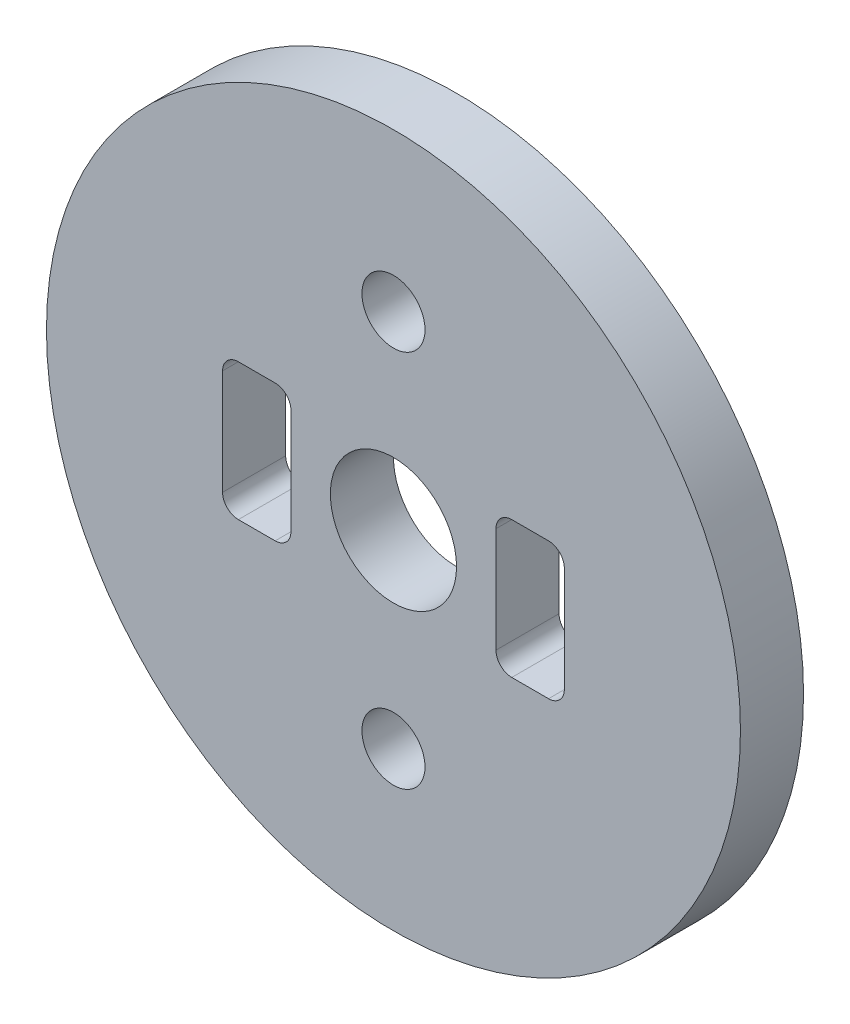
ISO-10303-21;
HEADER;
FILE_DESCRIPTION(('STEP AP214'),'2;1');
FILE_NAME('part.step','',(''),(''),'','','');
FILE_SCHEMA(('AUTOMOTIVE_DESIGN { 1 0 10303 214 1 1 1 1 }'));
ENDSEC;
DATA;
#1=APPLICATION_CONTEXT('core data for automotive mechanical design processes');
#2=APPLICATION_PROTOCOL_DEFINITION('international standard','automotive_design',2000,#1);
#3=PRODUCT_CONTEXT('',#1,'mechanical');
#4=PRODUCT('Part','Part','',(#3));
#5=PRODUCT_RELATED_PRODUCT_CATEGORY('part','',(#4));
#6=PRODUCT_DEFINITION_FORMATION('','',#4);
#7=PRODUCT_DEFINITION_CONTEXT('part definition',#1,'design');
#8=PRODUCT_DEFINITION('design','',#6,#7);
#9=PRODUCT_DEFINITION_SHAPE('','',#8);
#10=(LENGTH_UNIT() NAMED_UNIT(*) SI_UNIT(.MILLI.,.METRE.));
#11=(NAMED_UNIT(*) PLANE_ANGLE_UNIT() SI_UNIT($,.RADIAN.));
#12=(NAMED_UNIT(*) SI_UNIT($,.STERADIAN.) SOLID_ANGLE_UNIT());
#13=UNCERTAINTY_MEASURE_WITH_UNIT(LENGTH_MEASURE(1.E-05),#10,'distance_accuracy_value','');
#14=(GEOMETRIC_REPRESENTATION_CONTEXT(3) GLOBAL_UNCERTAINTY_ASSIGNED_CONTEXT((#13)) GLOBAL_UNIT_ASSIGNED_CONTEXT((#10,
#11,#12)) REPRESENTATION_CONTEXT('',''));
#15=CARTESIAN_POINT('',(0.,0.,0.));
#16=DIRECTION('',(0.,0.,1.));
#17=DIRECTION('',(1.,0.,0.));
#18=AXIS2_PLACEMENT_3D('',#15,#16,#17);
#19=CARTESIAN_POINT('',(215.7478079135,241.9520199932,3.));
#20=DIRECTION('',(0.,0.,1.));
#21=DIRECTION('',(1.,0.,0.));
#22=AXIS2_PLACEMENT_3D('',#19,#20,#21);
#23=PLANE('',#22);
#24=CARTESIAN_POINT('',(215.7478079135,250.9520199932,3.));
#25=DIRECTION('',(0.,0.,1.));
#26=DIRECTION('',(1.,0.,0.));
#27=AXIS2_PLACEMENT_3D('',#24,#25,#26);
#28=CIRCLE('',#27,1.5);
#29=CARTESIAN_POINT('',(217.2478079135,250.9520199932,3.));
#30=VERTEX_POINT('',#29);
#31=EDGE_CURVE('E184',#30,#30,#28,.T.);
#32=ORIENTED_EDGE('',*,*,#31,.F.);
#33=EDGE_LOOP('',(#32));
#34=FACE_BOUND('',#33,.T.);
#35=DIRECTION('',(0.,-1.,0.));
#36=VECTOR('',#35,1.);
#37=CARTESIAN_POINT('',(220.6228079135,244.4520199932,3.));
#38=LINE('',#37,#36);
#39=CARTESIAN_POINT('',(220.6228079135,244.4520199932,3.));
#40=VERTEX_POINT('',#39);
#41=CARTESIAN_POINT('',(220.6228079135,239.4520199932,3.));
#42=VERTEX_POINT('',#41);
#43=EDGE_CURVE('E216',#40,#42,#38,.T.);
#44=ORIENTED_EDGE('',*,*,#43,.F.);
#45=CARTESIAN_POINT('',(221.3728079135,244.4520199932,3.));
#46=DIRECTION('',(0.,0.,1.));
#47=DIRECTION('',(1.,0.,0.));
#48=AXIS2_PLACEMENT_3D('',#45,#46,#47);
#49=CIRCLE('',#48,0.750000000000001);
#50=CARTESIAN_POINT('',(221.3728079135,245.2020199932,3.));
#51=VERTEX_POINT('',#50);
#52=EDGE_CURVE('E214',#51,#40,#49,.T.);
#53=ORIENTED_EDGE('',*,*,#52,.F.);
#54=DIRECTION('',(-1.,0.,0.));
#55=VECTOR('',#54,1.);
#56=CARTESIAN_POINT('',(223.1228079135,245.2020199932,3.));
#57=LINE('',#56,#55);
#58=CARTESIAN_POINT('',(223.1228079135,245.2020199932,3.));
#59=VERTEX_POINT('',#58);
#60=EDGE_CURVE('E230',#59,#51,#57,.T.);
#61=ORIENTED_EDGE('',*,*,#60,.F.);
#62=CARTESIAN_POINT('',(223.1228079135,244.4520199932,3.));
#63=DIRECTION('',(0.,0.,1.));
#64=DIRECTION('',(1.,0.,0.));
#65=AXIS2_PLACEMENT_3D('',#62,#63,#64);
#66=CIRCLE('',#65,0.750000000000001);
#67=CARTESIAN_POINT('',(223.8728079135,244.4520199932,3.));
#68=VERTEX_POINT('',#67);
#69=EDGE_CURVE('E227',#68,#59,#66,.T.);
#70=ORIENTED_EDGE('',*,*,#69,.F.);
#71=DIRECTION('',(0.,1.,0.));
#72=VECTOR('',#71,1.);
#73=CARTESIAN_POINT('',(223.8728079135,239.4520199932,3.));
#74=LINE('',#73,#72);
#75=CARTESIAN_POINT('',(223.8728079135,239.4520199932,3.));
#76=VERTEX_POINT('',#75);
#77=EDGE_CURVE('E225',#76,#68,#74,.T.);
#78=ORIENTED_EDGE('',*,*,#77,.F.);
#79=CARTESIAN_POINT('',(223.1228079135,239.4520199932,3.));
#80=DIRECTION('',(0.,0.,1.));
#81=DIRECTION('',(1.,0.,0.));
#82=AXIS2_PLACEMENT_3D('',#79,#80,#81);
#83=CIRCLE('',#82,0.750000000000001);
#84=CARTESIAN_POINT('',(223.1228079135,238.7020199932,3.));
#85=VERTEX_POINT('',#84);
#86=EDGE_CURVE('E223',#85,#76,#83,.T.);
#87=ORIENTED_EDGE('',*,*,#86,.F.);
#88=DIRECTION('',(1.,0.,0.));
#89=VECTOR('',#88,1.);
#90=CARTESIAN_POINT('',(221.3728079135,238.7020199932,3.));
#91=LINE('',#90,#89);
#92=CARTESIAN_POINT('',(221.3728079135,238.7020199932,3.));
#93=VERTEX_POINT('',#92);
#94=EDGE_CURVE('E221',#93,#85,#91,.T.);
#95=ORIENTED_EDGE('',*,*,#94,.F.);
#96=CARTESIAN_POINT('',(221.3728079135,239.4520199932,3.));
#97=DIRECTION('',(0.,0.,1.));
#98=DIRECTION('',(1.,0.,0.));
#99=AXIS2_PLACEMENT_3D('',#96,#97,#98);
#100=CIRCLE('',#99,0.750000000000001);
#101=EDGE_CURVE('E219',#42,#93,#100,.T.);
#102=ORIENTED_EDGE('',*,*,#101,.F.);
#103=EDGE_LOOP('',(#44,#53,#61,#70,#78,#87,#95,#102));
#104=FACE_BOUND('',#103,.T.);
#105=CARTESIAN_POINT('',(215.7478079135,241.9520199932,3.));
#106=DIRECTION('',(0.,0.,1.));
#107=DIRECTION('',(1.,0.,0.));
#108=AXIS2_PLACEMENT_3D('',#105,#106,#107);
#109=CIRCLE('',#108,16.5);
#110=CARTESIAN_POINT('',(232.2478079135,241.9520199932,3.));
#111=VERTEX_POINT('',#110);
#112=EDGE_CURVE('E11',#111,#111,#109,.T.);
#113=ORIENTED_EDGE('',*,*,#112,.T.);
#114=EDGE_LOOP('',(#113));
#115=FACE_BOUND('',#114,.T.);
#116=CARTESIAN_POINT('',(215.7478079135,241.9520199932,3.));
#117=DIRECTION('',(0.,0.,1.));
#118=DIRECTION('',(1.,0.,0.));
#119=AXIS2_PLACEMENT_3D('',#116,#117,#118);
#120=CIRCLE('',#119,3.);
#121=CARTESIAN_POINT('',(218.7478079135,241.9520199932,3.));
#122=VERTEX_POINT('',#121);
#123=EDGE_CURVE('E273',#122,#122,#120,.T.);
#124=ORIENTED_EDGE('',*,*,#123,.F.);
#125=EDGE_LOOP('',(#124));
#126=FACE_BOUND('',#125,.T.);
#127=DIRECTION('',(-1.,0.,0.));
#128=VECTOR('',#127,1.);
#129=CARTESIAN_POINT('',(208.3728079135,245.2020199932,3.));
#130=LINE('',#129,#128);
#131=CARTESIAN_POINT('',(210.1228079135,245.2020199932,3.));
#132=VERTEX_POINT('',#131);
#133=CARTESIAN_POINT('',(208.3728079135,245.2020199932,3.));
#134=VERTEX_POINT('',#133);
#135=EDGE_CURVE('E154',#132,#134,#130,.T.);
#136=ORIENTED_EDGE('',*,*,#135,.F.);
#137=CARTESIAN_POINT('',(210.1228079135,244.4520199932,3.));
#138=DIRECTION('',(0.,0.,1.));
#139=DIRECTION('',(1.,0.,0.));
#140=AXIS2_PLACEMENT_3D('',#137,#138,#139);
#141=CIRCLE('',#140,0.750000000000001);
#142=CARTESIAN_POINT('',(210.8728079135,244.4520199932,3.));
#143=VERTEX_POINT('',#142);
#144=EDGE_CURVE('E146',#143,#132,#141,.T.);
#145=ORIENTED_EDGE('',*,*,#144,.F.);
#146=DIRECTION('',(0.,1.,0.));
#147=VECTOR('',#146,1.);
#148=CARTESIAN_POINT('',(210.8728079135,244.4520199932,3.));
#149=LINE('',#148,#147);
#150=CARTESIAN_POINT('',(210.8728079135,239.4520199932,3.));
#151=VERTEX_POINT('',#150);
#152=EDGE_CURVE('E181',#151,#143,#149,.T.);
#153=ORIENTED_EDGE('',*,*,#152,.F.);
#154=CARTESIAN_POINT('',(210.1228079135,239.4520199932,3.));
#155=DIRECTION('',(0.,0.,1.));
#156=DIRECTION('',(1.,0.,0.));
#157=AXIS2_PLACEMENT_3D('',#154,#155,#156);
#158=CIRCLE('',#157,0.750000000000001);
#159=CARTESIAN_POINT('',(210.1228079135,238.7020199932,3.));
#160=VERTEX_POINT('',#159);
#161=EDGE_CURVE('E179',#160,#151,#158,.T.);
#162=ORIENTED_EDGE('',*,*,#161,.F.);
#163=DIRECTION('',(1.,0.,0.));
#164=VECTOR('',#163,1.);
#165=CARTESIAN_POINT('',(210.1228079135,238.7020199932,3.));
#166=LINE('',#165,#164);
#167=CARTESIAN_POINT('',(208.3728079135,238.7020199932,3.));
#168=VERTEX_POINT('',#167);
#169=EDGE_CURVE('E177',#168,#160,#166,.T.);
#170=ORIENTED_EDGE('',*,*,#169,.F.);
#171=CARTESIAN_POINT('',(208.3728079135,239.4520199932,3.));
#172=DIRECTION('',(0.,0.,1.));
#173=DIRECTION('',(1.,0.,0.));
#174=AXIS2_PLACEMENT_3D('',#171,#172,#173);
#175=CIRCLE('',#174,0.750000000000237);
#176=CARTESIAN_POINT('',(207.6228079135,239.4520199932,3.));
#177=VERTEX_POINT('',#176);
#178=EDGE_CURVE('E175',#177,#168,#175,.T.);
#179=ORIENTED_EDGE('',*,*,#178,.F.);
#180=DIRECTION('',(0.,-1.,0.));
#181=VECTOR('',#180,1.);
#182=CARTESIAN_POINT('',(207.6228079135,239.4520199932,3.));
#183=LINE('',#182,#181);
#184=CARTESIAN_POINT('',(207.6228079135,244.4520199932,3.));
#185=VERTEX_POINT('',#184);
#186=EDGE_CURVE('E170',#185,#177,#183,.T.);
#187=ORIENTED_EDGE('',*,*,#186,.F.);
#188=CARTESIAN_POINT('',(208.3728079135,244.4520199932,3.));
#189=DIRECTION('',(0.,0.,1.));
#190=DIRECTION('',(1.,0.,0.));
#191=AXIS2_PLACEMENT_3D('',#188,#189,#190);
#192=CIRCLE('',#191,0.750000000000001);
#193=EDGE_CURVE('E168',#134,#185,#192,.T.);
#194=ORIENTED_EDGE('',*,*,#193,.F.);
#195=EDGE_LOOP('',(#136,#145,#153,#162,#170,#179,#187,#194));
#196=FACE_BOUND('',#195,.T.);
#197=CARTESIAN_POINT('',(215.7478079135,232.9520199932,3.));
#198=DIRECTION('',(0.,0.,1.));
#199=DIRECTION('',(1.,0.,0.));
#200=AXIS2_PLACEMENT_3D('',#197,#198,#199);
#201=CIRCLE('',#200,1.5);
#202=CARTESIAN_POINT('',(217.2478079135,232.9520199932,3.));
#203=VERTEX_POINT('',#202);
#204=EDGE_CURVE('E502',#203,#203,#201,.T.);
#205=ORIENTED_EDGE('',*,*,#204,.F.);
#206=EDGE_LOOP('',(#205));
#207=FACE_BOUND('',#206,.T.);
#208=ADVANCED_FACE('F33',(#34,#104,#115,#126,#196,#207),#23,.T.);
#209=CARTESIAN_POINT('',(215.7478079135,241.9520199932,0.));
#210=DIRECTION('',(0.,0.,1.));
#211=DIRECTION('',(1.,0.,0.));
#212=AXIS2_PLACEMENT_3D('',#209,#210,#211);
#213=PLANE('',#212);
#214=CARTESIAN_POINT('',(215.7478079135,250.9520199932,0.));
#215=DIRECTION('',(0.,0.,1.));
#216=DIRECTION('',(1.,0.,0.));
#217=AXIS2_PLACEMENT_3D('',#214,#215,#216);
#218=CIRCLE('',#217,1.5);
#219=CARTESIAN_POINT('',(217.2478079135,250.9520199932,0.));
#220=VERTEX_POINT('',#219);
#221=EDGE_CURVE('E508',#220,#220,#218,.T.);
#222=ORIENTED_EDGE('',*,*,#221,.T.);
#223=EDGE_LOOP('',(#222));
#224=FACE_BOUND('',#223,.T.);
#225=CARTESIAN_POINT('',(221.3728079135,244.4520199932,0.));
#226=DIRECTION('',(0.,0.,1.));
#227=DIRECTION('',(1.,0.,0.));
#228=AXIS2_PLACEMENT_3D('',#225,#226,#227);
#229=CIRCLE('',#228,0.750000000000001);
#230=CARTESIAN_POINT('',(221.3728079135,245.2020199932,0.));
#231=VERTEX_POINT('',#230);
#232=CARTESIAN_POINT('',(220.6228079135,244.4520199932,0.));
#233=VERTEX_POINT('',#232);
#234=EDGE_CURVE('E162',#231,#233,#229,.T.);
#235=ORIENTED_EDGE('',*,*,#234,.T.);
#236=DIRECTION('',(0.,-1.,0.));
#237=VECTOR('',#236,1.);
#238=CARTESIAN_POINT('',(220.6228079135,244.4520199932,0.));
#239=LINE('',#238,#237);
#240=CARTESIAN_POINT('',(220.6228079135,239.4520199932,0.));
#241=VERTEX_POINT('',#240);
#242=EDGE_CURVE('E235',#233,#241,#239,.T.);
#243=ORIENTED_EDGE('',*,*,#242,.T.);
#244=CARTESIAN_POINT('',(221.3728079135,239.4520199932,0.));
#245=DIRECTION('',(0.,0.,1.));
#246=DIRECTION('',(1.,0.,0.));
#247=AXIS2_PLACEMENT_3D('',#244,#245,#246);
#248=CIRCLE('',#247,0.750000000000001);
#249=CARTESIAN_POINT('',(221.3728079135,238.7020199932,0.));
#250=VERTEX_POINT('',#249);
#251=EDGE_CURVE('E238',#241,#250,#248,.T.);
#252=ORIENTED_EDGE('',*,*,#251,.T.);
#253=DIRECTION('',(1.,0.,0.));
#254=VECTOR('',#253,1.);
#255=CARTESIAN_POINT('',(221.3728079135,238.7020199932,0.));
#256=LINE('',#255,#254);
#257=CARTESIAN_POINT('',(223.1228079135,238.7020199932,0.));
#258=VERTEX_POINT('',#257);
#259=EDGE_CURVE('E241',#250,#258,#256,.T.);
#260=ORIENTED_EDGE('',*,*,#259,.T.);
#261=CARTESIAN_POINT('',(223.1228079135,239.4520199932,0.));
#262=DIRECTION('',(0.,0.,1.));
#263=DIRECTION('',(1.,0.,0.));
#264=AXIS2_PLACEMENT_3D('',#261,#262,#263);
#265=CIRCLE('',#264,0.750000000000001);
#266=CARTESIAN_POINT('',(223.8728079135,239.4520199932,0.));
#267=VERTEX_POINT('',#266);
#268=EDGE_CURVE('E244',#258,#267,#265,.T.);
#269=ORIENTED_EDGE('',*,*,#268,.T.);
#270=DIRECTION('',(0.,1.,0.));
#271=VECTOR('',#270,1.);
#272=CARTESIAN_POINT('',(223.8728079135,239.4520199932,0.));
#273=LINE('',#272,#271);
#274=CARTESIAN_POINT('',(223.8728079135,244.4520199932,0.));
#275=VERTEX_POINT('',#274);
#276=EDGE_CURVE('E247',#267,#275,#273,.T.);
#277=ORIENTED_EDGE('',*,*,#276,.T.);
#278=CARTESIAN_POINT('',(223.1228079135,244.4520199932,0.));
#279=DIRECTION('',(0.,0.,1.));
#280=DIRECTION('',(1.,0.,0.));
#281=AXIS2_PLACEMENT_3D('',#278,#279,#280);
#282=CIRCLE('',#281,0.750000000000001);
#283=CARTESIAN_POINT('',(223.1228079135,245.2020199932,0.));
#284=VERTEX_POINT('',#283);
#285=EDGE_CURVE('E250',#275,#284,#282,.T.);
#286=ORIENTED_EDGE('',*,*,#285,.T.);
#287=DIRECTION('',(-1.,0.,0.));
#288=VECTOR('',#287,1.);
#289=CARTESIAN_POINT('',(223.1228079135,245.2020199932,0.));
#290=LINE('',#289,#288);
#291=EDGE_CURVE('E217',#284,#231,#290,.T.);
#292=ORIENTED_EDGE('',*,*,#291,.T.);
#293=EDGE_LOOP('',(#235,#243,#252,#260,#269,#277,#286,#292));
#294=FACE_BOUND('',#293,.T.);
#295=CARTESIAN_POINT('',(215.7478079135,241.9520199932,0.));
#296=DIRECTION('',(0.,0.,1.));
#297=DIRECTION('',(1.,0.,0.));
#298=AXIS2_PLACEMENT_3D('',#295,#296,#297);
#299=CIRCLE('',#298,16.5);
#300=CARTESIAN_POINT('',(232.2478079135,241.9520199932,0.));
#301=VERTEX_POINT('',#300);
#302=EDGE_CURVE('E37',#301,#301,#299,.T.);
#303=ORIENTED_EDGE('',*,*,#302,.F.);
#304=EDGE_LOOP('',(#303));
#305=FACE_BOUND('',#304,.T.);
#306=CARTESIAN_POINT('',(215.7478079135,241.9520199932,0.));
#307=DIRECTION('',(0.,0.,1.));
#308=DIRECTION('',(1.,0.,0.));
#309=AXIS2_PLACEMENT_3D('',#306,#307,#308);
#310=CIRCLE('',#309,3.);
#311=CARTESIAN_POINT('',(218.7478079135,241.9520199932,0.));
#312=VERTEX_POINT('',#311);
#313=EDGE_CURVE('E272',#312,#312,#310,.T.);
#314=ORIENTED_EDGE('',*,*,#313,.T.);
#315=EDGE_LOOP('',(#314));
#316=FACE_BOUND('',#315,.T.);
#317=CARTESIAN_POINT('',(210.1228079135,244.4520199932,0.));
#318=DIRECTION('',(0.,0.,1.));
#319=DIRECTION('',(1.,0.,0.));
#320=AXIS2_PLACEMENT_3D('',#317,#318,#319);
#321=CIRCLE('',#320,0.750000000000001);
#322=CARTESIAN_POINT('',(210.8728079135,244.4520199932,0.));
#323=VERTEX_POINT('',#322);
#324=CARTESIAN_POINT('',(210.1228079135,245.2020199932,0.));
#325=VERTEX_POINT('',#324);
#326=EDGE_CURVE('E56',#323,#325,#321,.T.);
#327=ORIENTED_EDGE('',*,*,#326,.T.);
#328=DIRECTION('',(-1.,0.,0.));
#329=VECTOR('',#328,1.);
#330=CARTESIAN_POINT('',(208.3728079135,245.2020199932,0.));
#331=LINE('',#330,#329);
#332=CARTESIAN_POINT('',(208.3728079135,245.2020199932,0.));
#333=VERTEX_POINT('',#332);
#334=EDGE_CURVE('E161',#325,#333,#331,.T.);
#335=ORIENTED_EDGE('',*,*,#334,.T.);
#336=CARTESIAN_POINT('',(208.3728079135,244.4520199932,0.));
#337=DIRECTION('',(0.,0.,1.));
#338=DIRECTION('',(1.,0.,0.));
#339=AXIS2_PLACEMENT_3D('',#336,#337,#338);
#340=CIRCLE('',#339,0.750000000000001);
#341=CARTESIAN_POINT('',(207.6228079135,244.4520199932,0.));
#342=VERTEX_POINT('',#341);
#343=EDGE_CURVE('E186',#333,#342,#340,.T.);
#344=ORIENTED_EDGE('',*,*,#343,.T.);
#345=DIRECTION('',(0.,-1.,0.));
#346=VECTOR('',#345,1.);
#347=CARTESIAN_POINT('',(207.6228079135,239.4520199932,0.));
#348=LINE('',#347,#346);
#349=CARTESIAN_POINT('',(207.6228079135,239.4520199932,0.));
#350=VERTEX_POINT('',#349);
#351=EDGE_CURVE('E189',#342,#350,#348,.T.);
#352=ORIENTED_EDGE('',*,*,#351,.T.);
#353=CARTESIAN_POINT('',(208.3728079135,239.4520199932,0.));
#354=DIRECTION('',(0.,0.,1.));
#355=DIRECTION('',(1.,0.,0.));
#356=AXIS2_PLACEMENT_3D('',#353,#354,#355);
#357=CIRCLE('',#356,0.750000000000237);
#358=CARTESIAN_POINT('',(208.3728079135,238.7020199932,0.));
#359=VERTEX_POINT('',#358);
#360=EDGE_CURVE('E192',#350,#359,#357,.T.);
#361=ORIENTED_EDGE('',*,*,#360,.T.);
#362=DIRECTION('',(1.,0.,0.));
#363=VECTOR('',#362,1.);
#364=CARTESIAN_POINT('',(210.1228079135,238.7020199932,0.));
#365=LINE('',#364,#363);
#366=CARTESIAN_POINT('',(210.1228079135,238.7020199932,0.));
#367=VERTEX_POINT('',#366);
#368=EDGE_CURVE('E195',#359,#367,#365,.T.);
#369=ORIENTED_EDGE('',*,*,#368,.T.);
#370=CARTESIAN_POINT('',(210.1228079135,239.4520199932,0.));
#371=DIRECTION('',(0.,0.,1.));
#372=DIRECTION('',(1.,0.,0.));
#373=AXIS2_PLACEMENT_3D('',#370,#371,#372);
#374=CIRCLE('',#373,0.750000000000001);
#375=CARTESIAN_POINT('',(210.8728079135,239.4520199932,0.));
#376=VERTEX_POINT('',#375);
#377=EDGE_CURVE('E198',#367,#376,#374,.T.);
#378=ORIENTED_EDGE('',*,*,#377,.T.);
#379=DIRECTION('',(0.,1.,0.));
#380=VECTOR('',#379,1.);
#381=CARTESIAN_POINT('',(210.8728079135,244.4520199932,0.));
#382=LINE('',#381,#380);
#383=EDGE_CURVE('E155',#376,#323,#382,.T.);
#384=ORIENTED_EDGE('',*,*,#383,.T.);
#385=EDGE_LOOP('',(#327,#335,#344,#352,#361,#369,#378,#384));
#386=FACE_BOUND('',#385,.T.);
#387=CARTESIAN_POINT('',(215.7478079135,232.9520199932,0.));
#388=DIRECTION('',(0.,0.,1.));
#389=DIRECTION('',(1.,0.,0.));
#390=AXIS2_PLACEMENT_3D('',#387,#388,#389);
#391=CIRCLE('',#390,1.5);
#392=CARTESIAN_POINT('',(217.2478079135,232.9520199932,0.));
#393=VERTEX_POINT('',#392);
#394=EDGE_CURVE('E505',#393,#393,#391,.T.);
#395=ORIENTED_EDGE('',*,*,#394,.T.);
#396=EDGE_LOOP('',(#395));
#397=FACE_BOUND('',#396,.T.);
#398=ADVANCED_FACE('F279',(#224,#294,#305,#316,#386,#397),#213,.F.);
#399=CARTESIAN_POINT('',(215.7478079135,241.9520199932,3.));
#400=DIRECTION('',(0.,0.,-1.));
#401=DIRECTION('',(-1.,0.,0.));
#402=AXIS2_PLACEMENT_3D('',#399,#400,#401);
#403=CYLINDRICAL_SURFACE('',#402,16.5);
#404=ORIENTED_EDGE('',*,*,#112,.F.);
#405=EDGE_LOOP('',(#404));
#406=FACE_BOUND('',#405,.T.);
#407=ORIENTED_EDGE('',*,*,#302,.T.);
#408=EDGE_LOOP('',(#407));
#409=FACE_BOUND('',#408,.T.);
#410=ADVANCED_FACE('F35',(#406,#409),#403,.T.);
#411=CARTESIAN_POINT('',(215.7478079135,241.9520199932,3.));
#412=DIRECTION('',(0.,0.,-1.));
#413=DIRECTION('',(-1.,0.,0.));
#414=AXIS2_PLACEMENT_3D('',#411,#412,#413);
#415=CYLINDRICAL_SURFACE('',#414,3.);
#416=ORIENTED_EDGE('',*,*,#123,.T.);
#417=EDGE_LOOP('',(#416));
#418=FACE_BOUND('',#417,.T.);
#419=ORIENTED_EDGE('',*,*,#313,.F.);
#420=EDGE_LOOP('',(#419));
#421=FACE_BOUND('',#420,.T.);
#422=ADVANCED_FACE('F282',(#418,#421),#415,.F.);
#423=CARTESIAN_POINT('',(221.3728079135,244.4520199932,3.));
#424=DIRECTION('',(0.,0.,-1.));
#425=DIRECTION('',(-1.,0.,0.));
#426=AXIS2_PLACEMENT_3D('',#423,#424,#425);
#427=CYLINDRICAL_SURFACE('',#426,0.750000000000001);
#428=ORIENTED_EDGE('',*,*,#234,.F.);
#429=DIRECTION('',(0.,0.,-1.));
#430=VECTOR('',#429,1.);
#431=CARTESIAN_POINT('',(221.3728079135,245.2020199932,3.));
#432=LINE('',#431,#430);
#433=EDGE_CURVE('E232',#51,#231,#432,.T.);
#434=ORIENTED_EDGE('',*,*,#433,.F.);
#435=ORIENTED_EDGE('',*,*,#52,.T.);
#436=DIRECTION('',(0.,0.,-1.));
#437=VECTOR('',#436,1.);
#438=CARTESIAN_POINT('',(220.6228079135,244.4520199932,3.));
#439=LINE('',#438,#437);
#440=EDGE_CURVE('E269',#40,#233,#439,.T.);
#441=ORIENTED_EDGE('',*,*,#440,.T.);
#442=EDGE_LOOP('',(#428,#434,#435,#441));
#443=FACE_BOUND('',#442,.T.);
#444=ADVANCED_FACE('F284',(#443),#427,.F.);
#445=CARTESIAN_POINT('',(220.6228079135,244.4520199932,3.));
#446=DIRECTION('',(1.,0.,0.));
#447=DIRECTION('',(0.,0.,-1.));
#448=AXIS2_PLACEMENT_3D('',#445,#446,#447);
#449=PLANE('',#448);
#450=ORIENTED_EDGE('',*,*,#242,.F.);
#451=ORIENTED_EDGE('',*,*,#440,.F.);
#452=ORIENTED_EDGE('',*,*,#43,.T.);
#453=DIRECTION('',(0.,0.,-1.));
#454=VECTOR('',#453,1.);
#455=CARTESIAN_POINT('',(220.6228079135,239.4520199932,3.));
#456=LINE('',#455,#454);
#457=EDGE_CURVE('E267',#42,#241,#456,.T.);
#458=ORIENTED_EDGE('',*,*,#457,.T.);
#459=EDGE_LOOP('',(#450,#451,#452,#458));
#460=FACE_BOUND('',#459,.T.);
#461=ADVANCED_FACE('F291',(#460),#449,.T.);
#462=CARTESIAN_POINT('',(221.3728079135,239.4520199932,3.));
#463=DIRECTION('',(0.,0.,-1.));
#464=DIRECTION('',(-1.,0.,0.));
#465=AXIS2_PLACEMENT_3D('',#462,#463,#464);
#466=CYLINDRICAL_SURFACE('',#465,0.750000000000001);
#467=ORIENTED_EDGE('',*,*,#251,.F.);
#468=ORIENTED_EDGE('',*,*,#457,.F.);
#469=ORIENTED_EDGE('',*,*,#101,.T.);
#470=DIRECTION('',(0.,0.,-1.));
#471=VECTOR('',#470,1.);
#472=CARTESIAN_POINT('',(221.3728079135,238.7020199932,3.));
#473=LINE('',#472,#471);
#474=EDGE_CURVE('E265',#93,#250,#473,.T.);
#475=ORIENTED_EDGE('',*,*,#474,.T.);
#476=EDGE_LOOP('',(#467,#468,#469,#475));
#477=FACE_BOUND('',#476,.T.);
#478=ADVANCED_FACE('F323',(#477),#466,.F.);
#479=CARTESIAN_POINT('',(221.3728079135,238.7020199932,3.));
#480=DIRECTION('',(0.,1.,0.));
#481=DIRECTION('',(0.,0.,1.));
#482=AXIS2_PLACEMENT_3D('',#479,#480,#481);
#483=PLANE('',#482);
#484=ORIENTED_EDGE('',*,*,#259,.F.);
#485=ORIENTED_EDGE('',*,*,#474,.F.);
#486=ORIENTED_EDGE('',*,*,#94,.T.);
#487=DIRECTION('',(0.,0.,-1.));
#488=VECTOR('',#487,1.);
#489=CARTESIAN_POINT('',(223.1228079135,238.7020199932,3.));
#490=LINE('',#489,#488);
#491=EDGE_CURVE('E263',#85,#258,#490,.T.);
#492=ORIENTED_EDGE('',*,*,#491,.T.);
#493=EDGE_LOOP('',(#484,#485,#486,#492));
#494=FACE_BOUND('',#493,.T.);
#495=ADVANCED_FACE('F347',(#494),#483,.T.);
#496=CARTESIAN_POINT('',(223.1228079135,239.4520199932,3.));
#497=DIRECTION('',(0.,0.,-1.));
#498=DIRECTION('',(-1.,0.,0.));
#499=AXIS2_PLACEMENT_3D('',#496,#497,#498);
#500=CYLINDRICAL_SURFACE('',#499,0.750000000000001);
#501=ORIENTED_EDGE('',*,*,#268,.F.);
#502=ORIENTED_EDGE('',*,*,#491,.F.);
#503=ORIENTED_EDGE('',*,*,#86,.T.);
#504=DIRECTION('',(0.,0.,-1.));
#505=VECTOR('',#504,1.);
#506=CARTESIAN_POINT('',(223.8728079135,239.4520199932,3.));
#507=LINE('',#506,#505);
#508=EDGE_CURVE('E261',#76,#267,#507,.T.);
#509=ORIENTED_EDGE('',*,*,#508,.T.);
#510=EDGE_LOOP('',(#501,#502,#503,#509));
#511=FACE_BOUND('',#510,.T.);
#512=ADVANCED_FACE('F344',(#511),#500,.F.);
#513=CARTESIAN_POINT('',(223.8728079135,239.4520199932,3.));
#514=DIRECTION('',(-1.,0.,0.));
#515=DIRECTION('',(0.,0.,1.));
#516=AXIS2_PLACEMENT_3D('',#513,#514,#515);
#517=PLANE('',#516);
#518=ORIENTED_EDGE('',*,*,#276,.F.);
#519=ORIENTED_EDGE('',*,*,#508,.F.);
#520=ORIENTED_EDGE('',*,*,#77,.T.);
#521=DIRECTION('',(0.,0.,-1.));
#522=VECTOR('',#521,1.);
#523=CARTESIAN_POINT('',(223.8728079135,244.4520199932,3.));
#524=LINE('',#523,#522);
#525=EDGE_CURVE('E259',#68,#275,#524,.T.);
#526=ORIENTED_EDGE('',*,*,#525,.T.);
#527=EDGE_LOOP('',(#518,#519,#520,#526));
#528=FACE_BOUND('',#527,.T.);
#529=ADVANCED_FACE('F341',(#528),#517,.T.);
#530=CARTESIAN_POINT('',(223.1228079135,244.4520199932,3.));
#531=DIRECTION('',(0.,0.,-1.));
#532=DIRECTION('',(-1.,0.,0.));
#533=AXIS2_PLACEMENT_3D('',#530,#531,#532);
#534=CYLINDRICAL_SURFACE('',#533,0.750000000000001);
#535=ORIENTED_EDGE('',*,*,#285,.F.);
#536=ORIENTED_EDGE('',*,*,#525,.F.);
#537=ORIENTED_EDGE('',*,*,#69,.T.);
#538=DIRECTION('',(0.,0.,-1.));
#539=VECTOR('',#538,1.);
#540=CARTESIAN_POINT('',(223.1228079135,245.2020199932,3.));
#541=LINE('',#540,#539);
#542=EDGE_CURVE('E257',#59,#284,#541,.T.);
#543=ORIENTED_EDGE('',*,*,#542,.T.);
#544=EDGE_LOOP('',(#535,#536,#537,#543));
#545=FACE_BOUND('',#544,.T.);
#546=ADVANCED_FACE('F335',(#545),#534,.F.);
#547=CARTESIAN_POINT('',(223.1228079135,245.2020199932,3.));
#548=DIRECTION('',(0.,-1.,0.));
#549=DIRECTION('',(0.,0.,-1.));
#550=AXIS2_PLACEMENT_3D('',#547,#548,#549);
#551=PLANE('',#550);
#552=ORIENTED_EDGE('',*,*,#291,.F.);
#553=ORIENTED_EDGE('',*,*,#542,.F.);
#554=ORIENTED_EDGE('',*,*,#60,.T.);
#555=ORIENTED_EDGE('',*,*,#433,.T.);
#556=EDGE_LOOP('',(#552,#553,#554,#555));
#557=FACE_BOUND('',#556,.T.);
#558=ADVANCED_FACE('F330',(#557),#551,.T.);
#559=CARTESIAN_POINT('',(210.1228079135,244.4520199932,3.));
#560=DIRECTION('',(0.,0.,-1.));
#561=DIRECTION('',(-1.,0.,0.));
#562=AXIS2_PLACEMENT_3D('',#559,#560,#561);
#563=CYLINDRICAL_SURFACE('',#562,0.750000000000001);
#564=ORIENTED_EDGE('',*,*,#326,.F.);
#565=DIRECTION('',(0.,0.,-1.));
#566=VECTOR('',#565,1.);
#567=CARTESIAN_POINT('',(210.8728079135,244.4520199932,3.));
#568=LINE('',#567,#566);
#569=EDGE_CURVE('E150',#143,#323,#568,.T.);
#570=ORIENTED_EDGE('',*,*,#569,.F.);
#571=ORIENTED_EDGE('',*,*,#144,.T.);
#572=DIRECTION('',(0.,0.,-1.));
#573=VECTOR('',#572,1.);
#574=CARTESIAN_POINT('',(210.1228079135,245.2020199932,3.));
#575=LINE('',#574,#573);
#576=EDGE_CURVE('E149',#132,#325,#575,.T.);
#577=ORIENTED_EDGE('',*,*,#576,.T.);
#578=EDGE_LOOP('',(#564,#570,#571,#577));
#579=FACE_BOUND('',#578,.T.);
#580=ADVANCED_FACE('F148',(#579),#563,.F.);
#581=CARTESIAN_POINT('',(208.3728079135,245.2020199932,3.));
#582=DIRECTION('',(0.,-1.,0.));
#583=DIRECTION('',(0.,0.,-1.));
#584=AXIS2_PLACEMENT_3D('',#581,#582,#583);
#585=PLANE('',#584);
#586=ORIENTED_EDGE('',*,*,#334,.F.);
#587=ORIENTED_EDGE('',*,*,#576,.F.);
#588=ORIENTED_EDGE('',*,*,#135,.T.);
#589=DIRECTION('',(0.,0.,-1.));
#590=VECTOR('',#589,1.);
#591=CARTESIAN_POINT('',(208.3728079135,245.2020199932,3.));
#592=LINE('',#591,#590);
#593=EDGE_CURVE('E163',#134,#333,#592,.T.);
#594=ORIENTED_EDGE('',*,*,#593,.T.);
#595=EDGE_LOOP('',(#586,#587,#588,#594));
#596=FACE_BOUND('',#595,.T.);
#597=ADVANCED_FACE('F158',(#596),#585,.T.);
#598=CARTESIAN_POINT('',(208.3728079135,244.4520199932,3.));
#599=DIRECTION('',(0.,0.,-1.));
#600=DIRECTION('',(-1.,0.,0.));
#601=AXIS2_PLACEMENT_3D('',#598,#599,#600);
#602=CYLINDRICAL_SURFACE('',#601,0.750000000000001);
#603=ORIENTED_EDGE('',*,*,#343,.F.);
#604=ORIENTED_EDGE('',*,*,#593,.F.);
#605=ORIENTED_EDGE('',*,*,#193,.T.);
#606=DIRECTION('',(0.,0.,-1.));
#607=VECTOR('',#606,1.);
#608=CARTESIAN_POINT('',(207.6228079135,244.4520199932,3.));
#609=LINE('',#608,#607);
#610=EDGE_CURVE('E211',#185,#342,#609,.T.);
#611=ORIENTED_EDGE('',*,*,#610,.T.);
#612=EDGE_LOOP('',(#603,#604,#605,#611));
#613=FACE_BOUND('',#612,.T.);
#614=ADVANCED_FACE('F417',(#613),#602,.F.);
#615=CARTESIAN_POINT('',(207.6228079135,239.4520199932,3.));
#616=DIRECTION('',(1.,0.,0.));
#617=DIRECTION('',(0.,0.,-1.));
#618=AXIS2_PLACEMENT_3D('',#615,#616,#617);
#619=PLANE('',#618);
#620=ORIENTED_EDGE('',*,*,#351,.F.);
#621=ORIENTED_EDGE('',*,*,#610,.F.);
#622=ORIENTED_EDGE('',*,*,#186,.T.);
#623=DIRECTION('',(0.,0.,-1.));
#624=VECTOR('',#623,1.);
#625=CARTESIAN_POINT('',(207.6228079135,239.4520199932,3.));
#626=LINE('',#625,#624);
#627=EDGE_CURVE('E209',#177,#350,#626,.T.);
#628=ORIENTED_EDGE('',*,*,#627,.T.);
#629=EDGE_LOOP('',(#620,#621,#622,#628));
#630=FACE_BOUND('',#629,.T.);
#631=ADVANCED_FACE('F426',(#630),#619,.T.);
#632=CARTESIAN_POINT('',(208.3728079135,239.4520199932,3.));
#633=DIRECTION('',(0.,0.,-1.));
#634=DIRECTION('',(-1.,0.,0.));
#635=AXIS2_PLACEMENT_3D('',#632,#633,#634);
#636=CYLINDRICAL_SURFACE('',#635,0.750000000000237);
#637=ORIENTED_EDGE('',*,*,#360,.F.);
#638=ORIENTED_EDGE('',*,*,#627,.F.);
#639=ORIENTED_EDGE('',*,*,#178,.T.);
#640=DIRECTION('',(0.,0.,-1.));
#641=VECTOR('',#640,1.);
#642=CARTESIAN_POINT('',(208.3728079135,238.7020199932,3.));
#643=LINE('',#642,#641);
#644=EDGE_CURVE('E207',#168,#359,#643,.T.);
#645=ORIENTED_EDGE('',*,*,#644,.T.);
#646=EDGE_LOOP('',(#637,#638,#639,#645));
#647=FACE_BOUND('',#646,.T.);
#648=ADVANCED_FACE('F436',(#647),#636,.F.);
#649=CARTESIAN_POINT('',(210.1228079135,238.7020199932,3.));
#650=DIRECTION('',(0.,1.,0.));
#651=DIRECTION('',(0.,0.,1.));
#652=AXIS2_PLACEMENT_3D('',#649,#650,#651);
#653=PLANE('',#652);
#654=ORIENTED_EDGE('',*,*,#368,.F.);
#655=ORIENTED_EDGE('',*,*,#644,.F.);
#656=ORIENTED_EDGE('',*,*,#169,.T.);
#657=DIRECTION('',(0.,0.,-1.));
#658=VECTOR('',#657,1.);
#659=CARTESIAN_POINT('',(210.1228079135,238.7020199932,3.));
#660=LINE('',#659,#658);
#661=EDGE_CURVE('E205',#160,#367,#660,.T.);
#662=ORIENTED_EDGE('',*,*,#661,.T.);
#663=EDGE_LOOP('',(#654,#655,#656,#662));
#664=FACE_BOUND('',#663,.T.);
#665=ADVANCED_FACE('F446',(#664),#653,.T.);
#666=CARTESIAN_POINT('',(210.1228079135,239.4520199932,3.));
#667=DIRECTION('',(0.,0.,-1.));
#668=DIRECTION('',(-1.,0.,0.));
#669=AXIS2_PLACEMENT_3D('',#666,#667,#668);
#670=CYLINDRICAL_SURFACE('',#669,0.750000000000001);
#671=ORIENTED_EDGE('',*,*,#377,.F.);
#672=ORIENTED_EDGE('',*,*,#661,.F.);
#673=ORIENTED_EDGE('',*,*,#161,.T.);
#674=DIRECTION('',(0.,0.,-1.));
#675=VECTOR('',#674,1.);
#676=CARTESIAN_POINT('',(210.8728079135,239.4520199932,3.));
#677=LINE('',#676,#675);
#678=EDGE_CURVE('E48',#151,#376,#677,.T.);
#679=ORIENTED_EDGE('',*,*,#678,.T.);
#680=EDGE_LOOP('',(#671,#672,#673,#679));
#681=FACE_BOUND('',#680,.T.);
#682=ADVANCED_FACE('F456',(#681),#670,.F.);
#683=CARTESIAN_POINT('',(210.8728079135,244.4520199932,3.));
#684=DIRECTION('',(-1.,0.,0.));
#685=DIRECTION('',(0.,0.,1.));
#686=AXIS2_PLACEMENT_3D('',#683,#684,#685);
#687=PLANE('',#686);
#688=ORIENTED_EDGE('',*,*,#383,.F.);
#689=ORIENTED_EDGE('',*,*,#678,.F.);
#690=ORIENTED_EDGE('',*,*,#152,.T.);
#691=ORIENTED_EDGE('',*,*,#569,.T.);
#692=EDGE_LOOP('',(#688,#689,#690,#691));
#693=FACE_BOUND('',#692,.T.);
#694=ADVANCED_FACE('F466',(#693),#687,.T.);
#695=CARTESIAN_POINT('',(215.7478079135,250.9520199932,3.));
#696=DIRECTION('',(0.,0.,-1.));
#697=DIRECTION('',(-1.,0.,0.));
#698=AXIS2_PLACEMENT_3D('',#695,#696,#697);
#699=CYLINDRICAL_SURFACE('',#698,1.5);
#700=ORIENTED_EDGE('',*,*,#31,.T.);
#701=EDGE_LOOP('',(#700));
#702=FACE_BOUND('',#701,.T.);
#703=ORIENTED_EDGE('',*,*,#221,.F.);
#704=EDGE_LOOP('',(#703));
#705=FACE_BOUND('',#704,.T.);
#706=ADVANCED_FACE('F476',(#702,#705),#699,.F.);
#707=CARTESIAN_POINT('',(215.7478079135,232.9520199932,3.));
#708=DIRECTION('',(0.,0.,-1.));
#709=DIRECTION('',(-1.,0.,0.));
#710=AXIS2_PLACEMENT_3D('',#707,#708,#709);
#711=CYLINDRICAL_SURFACE('',#710,1.5);
#712=ORIENTED_EDGE('',*,*,#204,.T.);
#713=EDGE_LOOP('',(#712));
#714=FACE_BOUND('',#713,.T.);
#715=ORIENTED_EDGE('',*,*,#394,.F.);
#716=EDGE_LOOP('',(#715));
#717=FACE_BOUND('',#716,.T.);
#718=ADVANCED_FACE('F485',(#714,#717),#711,.F.);
#719=CLOSED_SHELL('',(#208,#398,#410,#422,#444,#461,#478,#495,#512,#529,#546,#558,#580,#597,
#614,#631,#648,#665,#682,#694,#706,#718));
#720=MANIFOLD_SOLID_BREP('B2',#719);
#721=ADVANCED_BREP_SHAPE_REPRESENTATION('',(#18,#720),#14);
#722=SHAPE_DEFINITION_REPRESENTATION(#9,#721);
ENDSEC;
END-ISO-10303-21;
